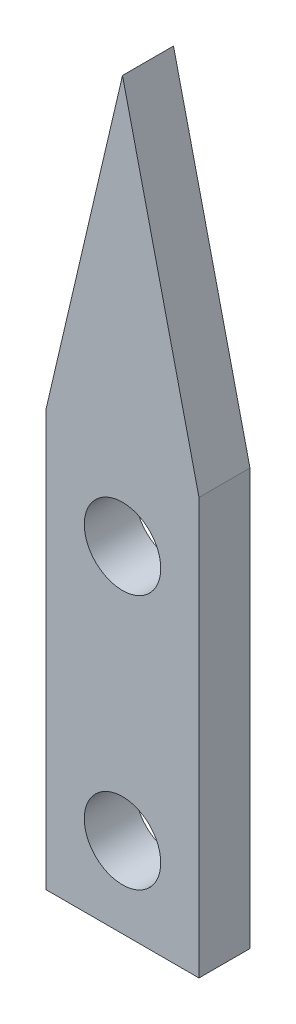
ISO-10303-21;
HEADER;
FILE_DESCRIPTION(('STEP AP214'),'2;1');
FILE_NAME('part.step','',(''),(''),'','','');
FILE_SCHEMA(('AUTOMOTIVE_DESIGN { 1 0 10303 214 1 1 1 1 }'));
ENDSEC;
DATA;
#1=APPLICATION_CONTEXT('core data for automotive mechanical design processes');
#2=APPLICATION_PROTOCOL_DEFINITION('international standard','automotive_design',2000,#1);
#3=PRODUCT_CONTEXT('',#1,'mechanical');
#4=PRODUCT('Part','Part','',(#3));
#5=PRODUCT_RELATED_PRODUCT_CATEGORY('part','',(#4));
#6=PRODUCT_DEFINITION_FORMATION('','',#4);
#7=PRODUCT_DEFINITION_CONTEXT('part definition',#1,'design');
#8=PRODUCT_DEFINITION('design','',#6,#7);
#9=PRODUCT_DEFINITION_SHAPE('','',#8);
#10=(LENGTH_UNIT() NAMED_UNIT(*) SI_UNIT(.MILLI.,.METRE.));
#11=(NAMED_UNIT(*) PLANE_ANGLE_UNIT() SI_UNIT($,.RADIAN.));
#12=(NAMED_UNIT(*) SI_UNIT($,.STERADIAN.) SOLID_ANGLE_UNIT());
#13=UNCERTAINTY_MEASURE_WITH_UNIT(LENGTH_MEASURE(1.E-05),#10,'distance_accuracy_value','');
#14=(GEOMETRIC_REPRESENTATION_CONTEXT(3) GLOBAL_UNCERTAINTY_ASSIGNED_CONTEXT((#13)) GLOBAL_UNIT_ASSIGNED_CONTEXT((#10,
#11,#12)) REPRESENTATION_CONTEXT('',''));
#15=CARTESIAN_POINT('',(0.,0.,0.));
#16=DIRECTION('',(0.,0.,1.));
#17=DIRECTION('',(1.,0.,0.));
#18=AXIS2_PLACEMENT_3D('',#15,#16,#17);
#19=CARTESIAN_POINT('',(0.,0.,2.));
#20=DIRECTION('',(0.,0.,-1.));
#21=DIRECTION('',(-1.,0.,0.));
#22=AXIS2_PLACEMENT_3D('',#19,#20,#21);
#23=PLANE('',#22);
#24=DIRECTION('',(-0.227587490575706,-0.97375763623884,0.));
#25=VECTOR('',#24,1.);
#26=CARTESIAN_POINT('',(0.,16.,2.));
#27=LINE('',#26,#25);
#28=CARTESIAN_POINT('',(0.,16.,2.));
#29=VERTEX_POINT('',#28);
#30=CARTESIAN_POINT('',(-3.,3.1641762852305,2.));
#31=VERTEX_POINT('',#30);
#32=EDGE_CURVE('E121',#29,#31,#27,.T.);
#33=ORIENTED_EDGE('',*,*,#32,.T.);
#34=DIRECTION('',(0.,-1.,0.));
#35=VECTOR('',#34,1.);
#36=CARTESIAN_POINT('',(-3.,3.1641762852305,2.));
#37=LINE('',#36,#35);
#38=CARTESIAN_POINT('',(-3.,-13.1641762852305,2.));
#39=VERTEX_POINT('',#38);
#40=EDGE_CURVE('E88',#31,#39,#37,.T.);
#41=ORIENTED_EDGE('',*,*,#40,.T.);
#42=DIRECTION('',(1.,0.,0.));
#43=VECTOR('',#42,1.);
#44=CARTESIAN_POINT('',(3.,-13.1641762852305,2.));
#45=LINE('',#44,#43);
#46=CARTESIAN_POINT('',(3.,-13.1641762852305,2.));
#47=VERTEX_POINT('',#46);
#48=EDGE_CURVE('E92',#39,#47,#45,.T.);
#49=ORIENTED_EDGE('',*,*,#48,.T.);
#50=DIRECTION('',(0.,1.,0.));
#51=VECTOR('',#50,1.);
#52=CARTESIAN_POINT('',(3.,3.16417628523051,2.));
#53=LINE('',#52,#51);
#54=CARTESIAN_POINT('',(3.,3.16417628523051,2.));
#55=VERTEX_POINT('',#54);
#56=EDGE_CURVE('E96',#47,#55,#53,.T.);
#57=ORIENTED_EDGE('',*,*,#56,.T.);
#58=DIRECTION('',(-0.227587490575705,0.97375763623884,0.));
#59=VECTOR('',#58,1.);
#60=CARTESIAN_POINT('',(3.,3.16417628523051,2.));
#61=LINE('',#60,#59);
#62=EDGE_CURVE('E54',#55,#29,#61,.T.);
#63=ORIENTED_EDGE('',*,*,#62,.T.);
#64=EDGE_LOOP('',(#33,#41,#49,#57,#63));
#65=FACE_BOUND('',#64,.T.);
#66=CARTESIAN_POINT('',(0.,0.,2.));
#67=DIRECTION('',(0.,0.,1.));
#68=DIRECTION('',(1.,0.,0.));
#69=AXIS2_PLACEMENT_3D('',#66,#67,#68);
#70=CIRCLE('',#69,1.5);
#71=CARTESIAN_POINT('',(1.5,0.,2.));
#72=VERTEX_POINT('',#71);
#73=EDGE_CURVE('E116',#72,#72,#70,.T.);
#74=ORIENTED_EDGE('',*,*,#73,.F.);
#75=EDGE_LOOP('',(#74));
#76=FACE_BOUND('',#75,.T.);
#77=CARTESIAN_POINT('',(0.,-10.,2.));
#78=DIRECTION('',(0.,0.,1.));
#79=DIRECTION('',(1.,0.,0.));
#80=AXIS2_PLACEMENT_3D('',#77,#78,#79);
#81=CIRCLE('',#80,1.5);
#82=CARTESIAN_POINT('',(1.5,-10.,2.));
#83=VERTEX_POINT('',#82);
#84=EDGE_CURVE('E157',#83,#83,#81,.T.);
#85=ORIENTED_EDGE('',*,*,#84,.F.);
#86=EDGE_LOOP('',(#85));
#87=FACE_BOUND('',#86,.T.);
#88=ADVANCED_FACE('F37',(#65,#76,#87),#23,.F.);
#89=CARTESIAN_POINT('',(0.,0.,0.));
#90=DIRECTION('',(0.,0.,-1.));
#91=DIRECTION('',(-1.,0.,0.));
#92=AXIS2_PLACEMENT_3D('',#89,#90,#91);
#93=PLANE('',#92);
#94=CARTESIAN_POINT('',(0.,0.,0.));
#95=DIRECTION('',(0.,0.,1.));
#96=DIRECTION('',(1.,0.,0.));
#97=AXIS2_PLACEMENT_3D('',#94,#95,#96);
#98=CIRCLE('',#97,1.5);
#99=CARTESIAN_POINT('',(1.5,0.,0.));
#100=VERTEX_POINT('',#99);
#101=EDGE_CURVE('E162',#100,#100,#98,.T.);
#102=ORIENTED_EDGE('',*,*,#101,.T.);
#103=EDGE_LOOP('',(#102));
#104=FACE_BOUND('',#103,.T.);
#105=DIRECTION('',(-0.227587490575706,-0.97375763623884,0.));
#106=VECTOR('',#105,1.);
#107=CARTESIAN_POINT('',(0.,16.,0.));
#108=LINE('',#107,#106);
#109=CARTESIAN_POINT('',(0.,16.,0.));
#110=VERTEX_POINT('',#109);
#111=CARTESIAN_POINT('',(-3.,3.1641762852305,0.));
#112=VERTEX_POINT('',#111);
#113=EDGE_CURVE('E112',#110,#112,#108,.T.);
#114=ORIENTED_EDGE('',*,*,#113,.F.);
#115=DIRECTION('',(-0.227587490575705,0.97375763623884,0.));
#116=VECTOR('',#115,1.);
#117=CARTESIAN_POINT('',(3.,3.16417628523051,0.));
#118=LINE('',#117,#116);
#119=CARTESIAN_POINT('',(3.,3.16417628523051,0.));
#120=VERTEX_POINT('',#119);
#121=EDGE_CURVE('E80',#120,#110,#118,.T.);
#122=ORIENTED_EDGE('',*,*,#121,.F.);
#123=DIRECTION('',(0.,1.,0.));
#124=VECTOR('',#123,1.);
#125=CARTESIAN_POINT('',(3.,3.16417628523051,0.));
#126=LINE('',#125,#124);
#127=CARTESIAN_POINT('',(3.,-13.1641762852305,0.));
#128=VERTEX_POINT('',#127);
#129=EDGE_CURVE('E74',#128,#120,#126,.T.);
#130=ORIENTED_EDGE('',*,*,#129,.F.);
#131=DIRECTION('',(1.,0.,0.));
#132=VECTOR('',#131,1.);
#133=CARTESIAN_POINT('',(3.,-13.1641762852305,0.));
#134=LINE('',#133,#132);
#135=CARTESIAN_POINT('',(-3.,-13.1641762852305,0.));
#136=VERTEX_POINT('',#135);
#137=EDGE_CURVE('E103',#136,#128,#134,.T.);
#138=ORIENTED_EDGE('',*,*,#137,.F.);
#139=DIRECTION('',(0.,-1.,0.));
#140=VECTOR('',#139,1.);
#141=CARTESIAN_POINT('',(-3.,3.1641762852305,0.));
#142=LINE('',#141,#140);
#143=EDGE_CURVE('E115',#112,#136,#142,.T.);
#144=ORIENTED_EDGE('',*,*,#143,.F.);
#145=EDGE_LOOP('',(#114,#122,#130,#138,#144));
#146=FACE_BOUND('',#145,.T.);
#147=CARTESIAN_POINT('',(0.,-10.,0.));
#148=DIRECTION('',(0.,0.,1.));
#149=DIRECTION('',(1.,0.,0.));
#150=AXIS2_PLACEMENT_3D('',#147,#148,#149);
#151=CIRCLE('',#150,1.5);
#152=CARTESIAN_POINT('',(1.5,-10.,0.));
#153=VERTEX_POINT('',#152);
#154=EDGE_CURVE('E160',#153,#153,#151,.T.);
#155=ORIENTED_EDGE('',*,*,#154,.T.);
#156=EDGE_LOOP('',(#155));
#157=FACE_BOUND('',#156,.T.);
#158=ADVANCED_FACE('F125',(#104,#146,#157),#93,.T.);
#159=CARTESIAN_POINT('',(0.,16.,2.));
#160=DIRECTION('',(0.97375763623884,-0.227587490575706,0.));
#161=DIRECTION('',(0.227587490575706,0.97375763623884,0.));
#162=AXIS2_PLACEMENT_3D('',#159,#160,#161);
#163=PLANE('',#162);
#164=ORIENTED_EDGE('',*,*,#113,.T.);
#165=DIRECTION('',(0.,0.,-1.));
#166=VECTOR('',#165,1.);
#167=CARTESIAN_POINT('',(-3.,3.1641762852305,2.));
#168=LINE('',#167,#166);
#169=EDGE_CURVE('E11',#31,#112,#168,.T.);
#170=ORIENTED_EDGE('',*,*,#169,.F.);
#171=ORIENTED_EDGE('',*,*,#32,.F.);
#172=DIRECTION('',(0.,0.,-1.));
#173=VECTOR('',#172,1.);
#174=CARTESIAN_POINT('',(0.,16.,2.));
#175=LINE('',#174,#173);
#176=EDGE_CURVE('E108',#29,#110,#175,.T.);
#177=ORIENTED_EDGE('',*,*,#176,.T.);
#178=EDGE_LOOP('',(#164,#170,#171,#177));
#179=FACE_BOUND('',#178,.T.);
#180=ADVANCED_FACE('F39',(#179),#163,.F.);
#181=CARTESIAN_POINT('',(-3.,3.1641762852305,2.));
#182=DIRECTION('',(1.,0.,0.));
#183=DIRECTION('',(0.,1.,0.));
#184=AXIS2_PLACEMENT_3D('',#181,#182,#183);
#185=PLANE('',#184);
#186=ORIENTED_EDGE('',*,*,#143,.T.);
#187=DIRECTION('',(0.,0.,-1.));
#188=VECTOR('',#187,1.);
#189=CARTESIAN_POINT('',(-3.,-13.1641762852305,2.));
#190=LINE('',#189,#188);
#191=EDGE_CURVE('E46',#39,#136,#190,.T.);
#192=ORIENTED_EDGE('',*,*,#191,.F.);
#193=ORIENTED_EDGE('',*,*,#40,.F.);
#194=ORIENTED_EDGE('',*,*,#169,.T.);
#195=EDGE_LOOP('',(#186,#192,#193,#194));
#196=FACE_BOUND('',#195,.T.);
#197=ADVANCED_FACE('F196',(#196),#185,.F.);
#198=CARTESIAN_POINT('',(3.,-13.1641762852305,2.));
#199=DIRECTION('',(0.,1.,0.));
#200=DIRECTION('',(-1.,0.,0.));
#201=AXIS2_PLACEMENT_3D('',#198,#199,#200);
#202=PLANE('',#201);
#203=ORIENTED_EDGE('',*,*,#137,.T.);
#204=DIRECTION('',(0.,0.,-1.));
#205=VECTOR('',#204,1.);
#206=CARTESIAN_POINT('',(3.,-13.1641762852305,2.));
#207=LINE('',#206,#205);
#208=EDGE_CURVE('E100',#47,#128,#207,.T.);
#209=ORIENTED_EDGE('',*,*,#208,.F.);
#210=ORIENTED_EDGE('',*,*,#48,.F.);
#211=ORIENTED_EDGE('',*,*,#191,.T.);
#212=EDGE_LOOP('',(#203,#209,#210,#211));
#213=FACE_BOUND('',#212,.T.);
#214=ADVANCED_FACE('F101',(#213),#202,.F.);
#215=CARTESIAN_POINT('',(3.,3.16417628523051,2.));
#216=DIRECTION('',(-1.,0.,0.));
#217=DIRECTION('',(0.,-1.,0.));
#218=AXIS2_PLACEMENT_3D('',#215,#216,#217);
#219=PLANE('',#218);
#220=ORIENTED_EDGE('',*,*,#129,.T.);
#221=DIRECTION('',(0.,0.,-1.));
#222=VECTOR('',#221,1.);
#223=CARTESIAN_POINT('',(3.,3.16417628523051,2.));
#224=LINE('',#223,#222);
#225=EDGE_CURVE('E104',#55,#120,#224,.T.);
#226=ORIENTED_EDGE('',*,*,#225,.F.);
#227=ORIENTED_EDGE('',*,*,#56,.F.);
#228=ORIENTED_EDGE('',*,*,#208,.T.);
#229=EDGE_LOOP('',(#220,#226,#227,#228));
#230=FACE_BOUND('',#229,.T.);
#231=ADVANCED_FACE('F106',(#230),#219,.F.);
#232=CARTESIAN_POINT('',(3.,3.16417628523051,2.));
#233=DIRECTION('',(-0.97375763623884,-0.227587490575706,0.));
#234=DIRECTION('',(0.227587490575706,-0.97375763623884,0.));
#235=AXIS2_PLACEMENT_3D('',#232,#233,#234);
#236=PLANE('',#235);
#237=ORIENTED_EDGE('',*,*,#121,.T.);
#238=ORIENTED_EDGE('',*,*,#176,.F.);
#239=ORIENTED_EDGE('',*,*,#62,.F.);
#240=ORIENTED_EDGE('',*,*,#225,.T.);
#241=EDGE_LOOP('',(#237,#238,#239,#240));
#242=FACE_BOUND('',#241,.T.);
#243=ADVANCED_FACE('F130',(#242),#236,.F.);
#244=CARTESIAN_POINT('',(0.,0.,2.));
#245=DIRECTION('',(0.,0.,-1.));
#246=DIRECTION('',(-1.,0.,0.));
#247=AXIS2_PLACEMENT_3D('',#244,#245,#246);
#248=CYLINDRICAL_SURFACE('',#247,1.5);
#249=ORIENTED_EDGE('',*,*,#73,.T.);
#250=EDGE_LOOP('',(#249));
#251=FACE_BOUND('',#250,.T.);
#252=ORIENTED_EDGE('',*,*,#101,.F.);
#253=EDGE_LOOP('',(#252));
#254=FACE_BOUND('',#253,.T.);
#255=ADVANCED_FACE('F132',(#251,#254),#248,.F.);
#256=CARTESIAN_POINT('',(0.,-10.,2.));
#257=DIRECTION('',(0.,0.,-1.));
#258=DIRECTION('',(-1.,0.,0.));
#259=AXIS2_PLACEMENT_3D('',#256,#257,#258);
#260=CYLINDRICAL_SURFACE('',#259,1.5);
#261=ORIENTED_EDGE('',*,*,#84,.T.);
#262=EDGE_LOOP('',(#261));
#263=FACE_BOUND('',#262,.T.);
#264=ORIENTED_EDGE('',*,*,#154,.F.);
#265=EDGE_LOOP('',(#264));
#266=FACE_BOUND('',#265,.T.);
#267=ADVANCED_FACE('F138',(#263,#266),#260,.F.);
#268=CLOSED_SHELL('',(#88,#158,#180,#197,#214,#231,#243,#255,#267));
#269=MANIFOLD_SOLID_BREP('B2',#268);
#270=ADVANCED_BREP_SHAPE_REPRESENTATION('',(#18,#269),#14);
#271=SHAPE_DEFINITION_REPRESENTATION(#9,#270);
ENDSEC;
END-ISO-10303-21;
